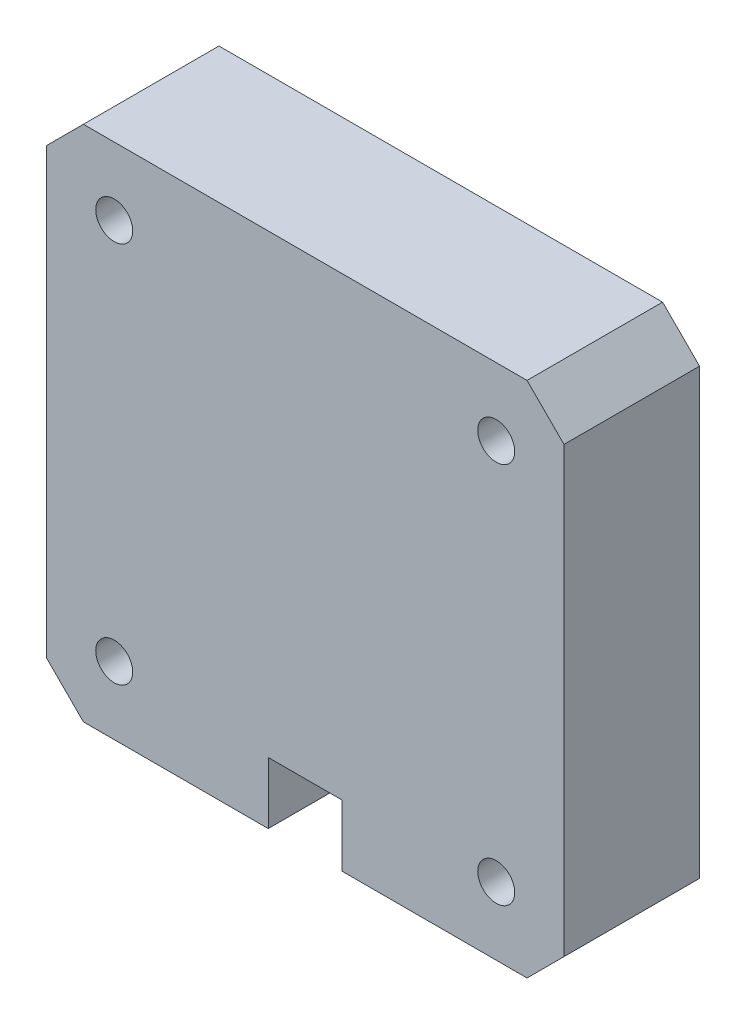
ISO-10303-21;
HEADER;
FILE_DESCRIPTION(('STEP AP214'),'2;1');
FILE_NAME('part.step','',(''),(''),'','','');
FILE_SCHEMA(('AUTOMOTIVE_DESIGN { 1 0 10303 214 1 1 1 1 }'));
ENDSEC;
DATA;
#1=APPLICATION_CONTEXT('core data for automotive mechanical design processes');
#2=APPLICATION_PROTOCOL_DEFINITION('international standard','automotive_design',2000,#1);
#3=PRODUCT_CONTEXT('',#1,'mechanical');
#4=PRODUCT('Part','Part','',(#3));
#5=PRODUCT_RELATED_PRODUCT_CATEGORY('part','',(#4));
#6=PRODUCT_DEFINITION_FORMATION('','',#4);
#7=PRODUCT_DEFINITION_CONTEXT('part definition',#1,'design');
#8=PRODUCT_DEFINITION('design','',#6,#7);
#9=PRODUCT_DEFINITION_SHAPE('','',#8);
#10=(LENGTH_UNIT() NAMED_UNIT(*) SI_UNIT(.MILLI.,.METRE.));
#11=(NAMED_UNIT(*) PLANE_ANGLE_UNIT() SI_UNIT($,.RADIAN.));
#12=(NAMED_UNIT(*) SI_UNIT($,.STERADIAN.) SOLID_ANGLE_UNIT());
#13=UNCERTAINTY_MEASURE_WITH_UNIT(LENGTH_MEASURE(1.E-05),#10,'distance_accuracy_value','');
#14=(GEOMETRIC_REPRESENTATION_CONTEXT(3) GLOBAL_UNCERTAINTY_ASSIGNED_CONTEXT((#13)) GLOBAL_UNIT_ASSIGNED_CONTEXT((#10,
#11,#12)) REPRESENTATION_CONTEXT('',''));
#15=CARTESIAN_POINT('',(0.,0.,0.));
#16=DIRECTION('',(0.,0.,1.));
#17=DIRECTION('',(1.,0.,0.));
#18=AXIS2_PLACEMENT_3D('',#15,#16,#17);
#19=CARTESIAN_POINT('',(15.5,-15.5,11.001));
#20=DIRECTION('',(0.,0.,-1.));
#21=DIRECTION('',(-1.,0.,0.));
#22=AXIS2_PLACEMENT_3D('',#19,#20,#21);
#23=CYLINDRICAL_SURFACE('',#22,1.5);
#24=CARTESIAN_POINT('',(15.5,-15.5,11.));
#25=DIRECTION('',(0.,0.,1.));
#26=DIRECTION('',(1.,0.,0.));
#27=AXIS2_PLACEMENT_3D('',#24,#25,#26);
#28=CIRCLE('',#27,1.5);
#29=CARTESIAN_POINT('',(17.,-15.5,11.));
#30=VERTEX_POINT('',#29);
#31=EDGE_CURVE('E180',#30,#30,#28,.F.);
#32=ORIENTED_EDGE('',*,*,#31,.F.);
#33=EDGE_LOOP('',(#32));
#34=FACE_BOUND('',#33,.T.);
#35=CARTESIAN_POINT('',(15.5,-15.5,3.));
#36=DIRECTION('',(0.,0.,-1.));
#37=DIRECTION('',(-1.,0.,0.));
#38=AXIS2_PLACEMENT_3D('',#35,#36,#37);
#39=CIRCLE('',#38,1.5);
#40=CARTESIAN_POINT('',(14.,-15.5,3.));
#41=VERTEX_POINT('',#40);
#42=EDGE_CURVE('E37',#41,#41,#39,.F.);
#43=ORIENTED_EDGE('',*,*,#42,.F.);
#44=EDGE_LOOP('',(#43));
#45=FACE_BOUND('',#44,.T.);
#46=ADVANCED_FACE('F33',(#34,#45),#23,.F.);
#47=CARTESIAN_POINT('',(-15.5,-15.5,11.001));
#48=DIRECTION('',(0.,0.,-1.));
#49=DIRECTION('',(-1.,0.,0.));
#50=AXIS2_PLACEMENT_3D('',#47,#48,#49);
#51=CYLINDRICAL_SURFACE('',#50,1.5);
#52=CARTESIAN_POINT('',(-15.5,-15.5,11.));
#53=DIRECTION('',(0.,0.,1.));
#54=DIRECTION('',(1.,0.,0.));
#55=AXIS2_PLACEMENT_3D('',#52,#53,#54);
#56=CIRCLE('',#55,1.5);
#57=CARTESIAN_POINT('',(-14.,-15.5,11.));
#58=VERTEX_POINT('',#57);
#59=EDGE_CURVE('E183',#58,#58,#56,.F.);
#60=ORIENTED_EDGE('',*,*,#59,.F.);
#61=EDGE_LOOP('',(#60));
#62=FACE_BOUND('',#61,.T.);
#63=CARTESIAN_POINT('',(-15.5,-15.5,3.));
#64=DIRECTION('',(0.,0.,-1.));
#65=DIRECTION('',(-1.,0.,0.));
#66=AXIS2_PLACEMENT_3D('',#63,#64,#65);
#67=CIRCLE('',#66,1.5);
#68=CARTESIAN_POINT('',(-17.,-15.5,3.));
#69=VERTEX_POINT('',#68);
#70=EDGE_CURVE('E162',#69,#69,#67,.F.);
#71=ORIENTED_EDGE('',*,*,#70,.F.);
#72=EDGE_LOOP('',(#71));
#73=FACE_BOUND('',#72,.T.);
#74=ADVANCED_FACE('F255',(#62,#73),#51,.F.);
#75=CARTESIAN_POINT('',(-15.5,15.5,11.001));
#76=DIRECTION('',(0.,0.,-1.));
#77=DIRECTION('',(-1.,0.,0.));
#78=AXIS2_PLACEMENT_3D('',#75,#76,#77);
#79=CYLINDRICAL_SURFACE('',#78,1.5);
#80=CARTESIAN_POINT('',(-15.5,15.5,11.));
#81=DIRECTION('',(0.,0.,1.));
#82=DIRECTION('',(1.,0.,0.));
#83=AXIS2_PLACEMENT_3D('',#80,#81,#82);
#84=CIRCLE('',#83,1.5);
#85=CARTESIAN_POINT('',(-14.,15.5,11.));
#86=VERTEX_POINT('',#85);
#87=EDGE_CURVE('E186',#86,#86,#84,.F.);
#88=ORIENTED_EDGE('',*,*,#87,.F.);
#89=EDGE_LOOP('',(#88));
#90=FACE_BOUND('',#89,.T.);
#91=CARTESIAN_POINT('',(-15.5,15.5,3.));
#92=DIRECTION('',(0.,0.,-1.));
#93=DIRECTION('',(-1.,0.,0.));
#94=AXIS2_PLACEMENT_3D('',#91,#92,#93);
#95=CIRCLE('',#94,1.5);
#96=CARTESIAN_POINT('',(-17.,15.5,3.));
#97=VERTEX_POINT('',#96);
#98=EDGE_CURVE('E169',#97,#97,#95,.F.);
#99=ORIENTED_EDGE('',*,*,#98,.F.);
#100=EDGE_LOOP('',(#99));
#101=FACE_BOUND('',#100,.T.);
#102=ADVANCED_FACE('F257',(#90,#101),#79,.F.);
#103=CARTESIAN_POINT('',(15.5,15.5,11.001));
#104=DIRECTION('',(0.,0.,-1.));
#105=DIRECTION('',(-1.,0.,0.));
#106=AXIS2_PLACEMENT_3D('',#103,#104,#105);
#107=CYLINDRICAL_SURFACE('',#106,1.5);
#108=CARTESIAN_POINT('',(15.5,15.5,11.));
#109=DIRECTION('',(0.,0.,1.));
#110=DIRECTION('',(1.,0.,0.));
#111=AXIS2_PLACEMENT_3D('',#108,#109,#110);
#112=CIRCLE('',#111,1.5);
#113=CARTESIAN_POINT('',(17.,15.5,11.));
#114=VERTEX_POINT('',#113);
#115=EDGE_CURVE('E189',#114,#114,#112,.F.);
#116=ORIENTED_EDGE('',*,*,#115,.F.);
#117=EDGE_LOOP('',(#116));
#118=FACE_BOUND('',#117,.T.);
#119=CARTESIAN_POINT('',(15.5,15.5,3.));
#120=DIRECTION('',(0.,0.,-1.));
#121=DIRECTION('',(-1.,0.,0.));
#122=AXIS2_PLACEMENT_3D('',#119,#120,#121);
#123=CIRCLE('',#122,1.5);
#124=CARTESIAN_POINT('',(14.,15.5,3.));
#125=VERTEX_POINT('',#124);
#126=EDGE_CURVE('E176',#125,#125,#123,.F.);
#127=ORIENTED_EDGE('',*,*,#126,.F.);
#128=EDGE_LOOP('',(#127));
#129=FACE_BOUND('',#128,.T.);
#130=ADVANCED_FACE('F264',(#118,#129),#107,.F.);
#131=CARTESIAN_POINT('',(-21.,21.,11.));
#132=DIRECTION('',(1.,0.,0.));
#133=DIRECTION('',(0.,0.,-1.));
#134=AXIS2_PLACEMENT_3D('',#131,#132,#133);
#135=PLANE('',#134);
#136=DIRECTION('',(0.,-1.,0.));
#137=VECTOR('',#136,1.);
#138=CARTESIAN_POINT('',(-21.,21.,0.));
#139=LINE('',#138,#137);
#140=CARTESIAN_POINT('',(-21.,18.,0.));
#141=VERTEX_POINT('',#140);
#142=CARTESIAN_POINT('',(-21.,-18.,0.));
#143=VERTEX_POINT('',#142);
#144=EDGE_CURVE('E192',#141,#143,#139,.T.);
#145=ORIENTED_EDGE('',*,*,#144,.T.);
#146=DIRECTION('',(0.,0.,1.));
#147=VECTOR('',#146,1.);
#148=CARTESIAN_POINT('',(-21.,-18.,11.));
#149=LINE('',#148,#147);
#150=CARTESIAN_POINT('',(-21.,-18.,11.));
#151=VERTEX_POINT('',#150);
#152=EDGE_CURVE('E243',#143,#151,#149,.T.);
#153=ORIENTED_EDGE('',*,*,#152,.T.);
#154=DIRECTION('',(0.,-1.,0.));
#155=VECTOR('',#154,1.);
#156=CARTESIAN_POINT('',(-21.,21.,11.));
#157=LINE('',#156,#155);
#158=CARTESIAN_POINT('',(-21.,18.,11.));
#159=VERTEX_POINT('',#158);
#160=EDGE_CURVE('E193',#159,#151,#157,.T.);
#161=ORIENTED_EDGE('',*,*,#160,.F.);
#162=DIRECTION('',(0.,0.,-1.));
#163=VECTOR('',#162,1.);
#164=CARTESIAN_POINT('',(-21.,18.,0.));
#165=LINE('',#164,#163);
#166=EDGE_CURVE('E240',#159,#141,#165,.T.);
#167=ORIENTED_EDGE('',*,*,#166,.T.);
#168=EDGE_LOOP('',(#145,#153,#161,#167));
#169=FACE_BOUND('',#168,.T.);
#170=ADVANCED_FACE('F274',(#169),#135,.F.);
#171=CARTESIAN_POINT('',(-21.,-21.,11.));
#172=DIRECTION('',(0.,1.,0.));
#173=DIRECTION('',(0.,0.,1.));
#174=AXIS2_PLACEMENT_3D('',#171,#172,#173);
#175=PLANE('',#174);
#176=DIRECTION('',(1.,0.,0.));
#177=VECTOR('',#176,1.);
#178=CARTESIAN_POINT('',(-21.,-21.,11.));
#179=LINE('',#178,#177);
#180=CARTESIAN_POINT('',(3.,-21.,11.));
#181=VERTEX_POINT('',#180);
#182=CARTESIAN_POINT('',(18.,-21.,11.));
#183=VERTEX_POINT('',#182);
#184=EDGE_CURVE('E196',#181,#183,#179,.T.);
#185=ORIENTED_EDGE('',*,*,#184,.F.);
#186=DIRECTION('',(0.,0.,1.));
#187=VECTOR('',#186,1.);
#188=CARTESIAN_POINT('',(3.,-21.,4.));
#189=LINE('',#188,#187);
#190=CARTESIAN_POINT('',(3.,-21.,4.));
#191=VERTEX_POINT('',#190);
#192=EDGE_CURVE('E327',#191,#181,#189,.T.);
#193=ORIENTED_EDGE('',*,*,#192,.F.);
#194=DIRECTION('',(1.,0.,0.));
#195=VECTOR('',#194,1.);
#196=CARTESIAN_POINT('',(3.,-21.,4.));
#197=LINE('',#196,#195);
#198=CARTESIAN_POINT('',(-3.,-21.,4.));
#199=VERTEX_POINT('',#198);
#200=EDGE_CURVE('E326',#199,#191,#197,.T.);
#201=ORIENTED_EDGE('',*,*,#200,.F.);
#202=DIRECTION('',(0.,0.,-1.));
#203=VECTOR('',#202,1.);
#204=CARTESIAN_POINT('',(-3.,-21.,4.));
#205=LINE('',#204,#203);
#206=CARTESIAN_POINT('',(-3.,-21.,11.));
#207=VERTEX_POINT('',#206);
#208=EDGE_CURVE('E323',#207,#199,#205,.T.);
#209=ORIENTED_EDGE('',*,*,#208,.F.);
#210=CARTESIAN_POINT('',(-18.,-21.,11.));
#211=VERTEX_POINT('',#210);
#212=EDGE_CURVE('E145',#211,#207,#179,.T.);
#213=ORIENTED_EDGE('',*,*,#212,.F.);
#214=DIRECTION('',(0.,0.,-1.));
#215=VECTOR('',#214,1.);
#216=CARTESIAN_POINT('',(-18.,-21.,11.));
#217=LINE('',#216,#215);
#218=CARTESIAN_POINT('',(-18.,-21.,0.));
#219=VERTEX_POINT('',#218);
#220=EDGE_CURVE('E227',#211,#219,#217,.T.);
#221=ORIENTED_EDGE('',*,*,#220,.T.);
#222=DIRECTION('',(1.,0.,0.));
#223=VECTOR('',#222,1.);
#224=CARTESIAN_POINT('',(-21.,-21.,0.));
#225=LINE('',#224,#223);
#226=CARTESIAN_POINT('',(18.,-21.,0.));
#227=VERTEX_POINT('',#226);
#228=EDGE_CURVE('E207',#219,#227,#225,.T.);
#229=ORIENTED_EDGE('',*,*,#228,.T.);
#230=DIRECTION('',(0.,0.,1.));
#231=VECTOR('',#230,1.);
#232=CARTESIAN_POINT('',(18.,-21.,11.));
#233=LINE('',#232,#231);
#234=EDGE_CURVE('E230',#227,#183,#233,.T.);
#235=ORIENTED_EDGE('',*,*,#234,.T.);
#236=EDGE_LOOP('',(#185,#193,#201,#209,#213,#221,#229,#235));
#237=FACE_BOUND('',#236,.T.);
#238=ADVANCED_FACE('F290',(#237),#175,.F.);
#239=CARTESIAN_POINT('',(21.,21.,11.));
#240=DIRECTION('',(1.,0.,0.));
#241=DIRECTION('',(0.,1.,0.));
#242=AXIS2_PLACEMENT_3D('',#239,#240,#241);
#243=PLANE('',#242);
#244=DIRECTION('',(0.,-1.,0.));
#245=VECTOR('',#244,1.);
#246=CARTESIAN_POINT('',(21.,21.,11.));
#247=LINE('',#246,#245);
#248=CARTESIAN_POINT('',(21.,18.,11.));
#249=VERTEX_POINT('',#248);
#250=CARTESIAN_POINT('',(21.,-18.,11.));
#251=VERTEX_POINT('',#250);
#252=EDGE_CURVE('E199',#249,#251,#247,.T.);
#253=ORIENTED_EDGE('',*,*,#252,.T.);
#254=DIRECTION('',(0.,0.,-1.));
#255=VECTOR('',#254,1.);
#256=CARTESIAN_POINT('',(21.,-18.,0.));
#257=LINE('',#256,#255);
#258=CARTESIAN_POINT('',(21.,-18.,0.));
#259=VERTEX_POINT('',#258);
#260=EDGE_CURVE('E216',#251,#259,#257,.T.);
#261=ORIENTED_EDGE('',*,*,#260,.T.);
#262=DIRECTION('',(0.,-1.,0.));
#263=VECTOR('',#262,1.);
#264=CARTESIAN_POINT('',(21.,21.,0.));
#265=LINE('',#264,#263);
#266=CARTESIAN_POINT('',(21.,18.,0.));
#267=VERTEX_POINT('',#266);
#268=EDGE_CURVE('E210',#267,#259,#265,.T.);
#269=ORIENTED_EDGE('',*,*,#268,.F.);
#270=DIRECTION('',(0.,0.,1.));
#271=VECTOR('',#270,1.);
#272=CARTESIAN_POINT('',(21.,18.,11.));
#273=LINE('',#272,#271);
#274=EDGE_CURVE('E204',#267,#249,#273,.T.);
#275=ORIENTED_EDGE('',*,*,#274,.T.);
#276=EDGE_LOOP('',(#253,#261,#269,#275));
#277=FACE_BOUND('',#276,.T.);
#278=ADVANCED_FACE('F286',(#277),#243,.T.);
#279=CARTESIAN_POINT('',(-21.,21.,11.));
#280=DIRECTION('',(0.,1.,0.));
#281=DIRECTION('',(0.,0.,1.));
#282=AXIS2_PLACEMENT_3D('',#279,#280,#281);
#283=PLANE('',#282);
#284=DIRECTION('',(1.,0.,0.));
#285=VECTOR('',#284,1.);
#286=CARTESIAN_POINT('',(-21.,21.,0.));
#287=LINE('',#286,#285);
#288=CARTESIAN_POINT('',(-18.,21.,0.));
#289=VERTEX_POINT('',#288);
#290=CARTESIAN_POINT('',(18.,21.,0.));
#291=VERTEX_POINT('',#290);
#292=EDGE_CURVE('E197',#289,#291,#287,.T.);
#293=ORIENTED_EDGE('',*,*,#292,.F.);
#294=DIRECTION('',(0.,0.,1.));
#295=VECTOR('',#294,1.);
#296=CARTESIAN_POINT('',(-18.,21.,11.));
#297=LINE('',#296,#295);
#298=CARTESIAN_POINT('',(-18.,21.,11.));
#299=VERTEX_POINT('',#298);
#300=EDGE_CURVE('E11',#289,#299,#297,.T.);
#301=ORIENTED_EDGE('',*,*,#300,.T.);
#302=DIRECTION('',(1.,0.,0.));
#303=VECTOR('',#302,1.);
#304=CARTESIAN_POINT('',(-21.,21.,11.));
#305=LINE('',#304,#303);
#306=CARTESIAN_POINT('',(18.,21.,11.));
#307=VERTEX_POINT('',#306);
#308=EDGE_CURVE('E202',#299,#307,#305,.T.);
#309=ORIENTED_EDGE('',*,*,#308,.T.);
#310=DIRECTION('',(0.,0.,-1.));
#311=VECTOR('',#310,1.);
#312=CARTESIAN_POINT('',(18.,21.,11.));
#313=LINE('',#312,#311);
#314=EDGE_CURVE('E42',#307,#291,#313,.T.);
#315=ORIENTED_EDGE('',*,*,#314,.T.);
#316=EDGE_LOOP('',(#293,#301,#309,#315));
#317=FACE_BOUND('',#316,.T.);
#318=ADVANCED_FACE('F279',(#317),#283,.T.);
#319=CARTESIAN_POINT('',(0.,0.,11.));
#320=DIRECTION('',(0.,0.,1.));
#321=DIRECTION('',(1.,0.,0.));
#322=AXIS2_PLACEMENT_3D('',#319,#320,#321);
#323=PLANE('',#322);
#324=DIRECTION('',(0.,-1.,0.));
#325=VECTOR('',#324,1.);
#326=CARTESIAN_POINT('',(3.,-16.,11.));
#327=LINE('',#326,#325);
#328=CARTESIAN_POINT('',(3.,-16.,11.));
#329=VERTEX_POINT('',#328);
#330=EDGE_CURVE('E146',#329,#181,#327,.T.);
#331=ORIENTED_EDGE('',*,*,#330,.T.);
#332=ORIENTED_EDGE('',*,*,#184,.T.);
#333=DIRECTION('',(0.707106781186549,0.707106781186546,0.));
#334=VECTOR('',#333,1.);
#335=CARTESIAN_POINT('',(19.5,-19.5,11.));
#336=LINE('',#335,#334);
#337=EDGE_CURVE('E238',#183,#251,#336,.T.);
#338=ORIENTED_EDGE('',*,*,#337,.T.);
#339=ORIENTED_EDGE('',*,*,#252,.F.);
#340=DIRECTION('',(0.707106781186546,-0.707106781186549,0.));
#341=VECTOR('',#340,1.);
#342=CARTESIAN_POINT('',(19.5,19.5,11.));
#343=LINE('',#342,#341);
#344=EDGE_CURVE('E58',#249,#307,#343,.F.);
#345=ORIENTED_EDGE('',*,*,#344,.T.);
#346=ORIENTED_EDGE('',*,*,#308,.F.);
#347=DIRECTION('',(-0.707106781186549,-0.707106781186546,0.));
#348=VECTOR('',#347,1.);
#349=CARTESIAN_POINT('',(-19.5,19.5,11.));
#350=LINE('',#349,#348);
#351=EDGE_CURVE('E234',#299,#159,#350,.T.);
#352=ORIENTED_EDGE('',*,*,#351,.T.);
#353=ORIENTED_EDGE('',*,*,#160,.T.);
#354=DIRECTION('',(-0.707106781186546,0.707106781186549,0.));
#355=VECTOR('',#354,1.);
#356=CARTESIAN_POINT('',(-19.5,-19.5,11.));
#357=LINE('',#356,#355);
#358=EDGE_CURVE('E236',#151,#211,#357,.F.);
#359=ORIENTED_EDGE('',*,*,#358,.T.);
#360=ORIENTED_EDGE('',*,*,#212,.T.);
#361=DIRECTION('',(0.,-1.,0.));
#362=VECTOR('',#361,1.);
#363=CARTESIAN_POINT('',(-3.,-16.,11.));
#364=LINE('',#363,#362);
#365=CARTESIAN_POINT('',(-3.,-16.,11.));
#366=VERTEX_POINT('',#365);
#367=EDGE_CURVE('E130',#366,#207,#364,.T.);
#368=ORIENTED_EDGE('',*,*,#367,.F.);
#369=DIRECTION('',(-1.,0.,0.));
#370=VECTOR('',#369,1.);
#371=CARTESIAN_POINT('',(3.,-16.,11.));
#372=LINE('',#371,#370);
#373=EDGE_CURVE('E135',#329,#366,#372,.T.);
#374=ORIENTED_EDGE('',*,*,#373,.F.);
#375=EDGE_LOOP('',(#331,#332,#338,#339,#345,#346,#352,#353,#359,#360,#368,#374));
#376=FACE_BOUND('',#375,.T.);
#377=ORIENTED_EDGE('',*,*,#31,.T.);
#378=EDGE_LOOP('',(#377));
#379=FACE_BOUND('',#378,.T.);
#380=ORIENTED_EDGE('',*,*,#59,.T.);
#381=EDGE_LOOP('',(#380));
#382=FACE_BOUND('',#381,.T.);
#383=ORIENTED_EDGE('',*,*,#87,.T.);
#384=EDGE_LOOP('',(#383));
#385=FACE_BOUND('',#384,.T.);
#386=ORIENTED_EDGE('',*,*,#115,.T.);
#387=EDGE_LOOP('',(#386));
#388=FACE_BOUND('',#387,.T.);
#389=ADVANCED_FACE('F142',(#376,#379,#382,#385,#388),#323,.T.);
#390=CARTESIAN_POINT('',(0.,0.,0.));
#391=DIRECTION('',(0.,0.,1.));
#392=DIRECTION('',(1.,0.,0.));
#393=AXIS2_PLACEMENT_3D('',#390,#391,#392);
#394=PLANE('',#393);
#395=CARTESIAN_POINT('',(15.5,-15.5,0.));
#396=DIRECTION('',(0.,0.,-1.));
#397=DIRECTION('',(-1.,0.,0.));
#398=AXIS2_PLACEMENT_3D('',#395,#396,#397);
#399=CIRCLE('',#398,2.85);
#400=CARTESIAN_POINT('',(12.65,-15.5,0.));
#401=VERTEX_POINT('',#400);
#402=EDGE_CURVE('E156',#401,#401,#399,.T.);
#403=ORIENTED_EDGE('',*,*,#402,.F.);
#404=EDGE_LOOP('',(#403));
#405=FACE_BOUND('',#404,.T.);
#406=CARTESIAN_POINT('',(-15.5,-15.5,0.));
#407=DIRECTION('',(0.,0.,-1.));
#408=DIRECTION('',(-1.,0.,0.));
#409=AXIS2_PLACEMENT_3D('',#406,#407,#408);
#410=CIRCLE('',#409,2.85);
#411=CARTESIAN_POINT('',(-18.35,-15.5,0.));
#412=VERTEX_POINT('',#411);
#413=EDGE_CURVE('E163',#412,#412,#410,.T.);
#414=ORIENTED_EDGE('',*,*,#413,.F.);
#415=EDGE_LOOP('',(#414));
#416=FACE_BOUND('',#415,.T.);
#417=CARTESIAN_POINT('',(-15.5,15.5,0.));
#418=DIRECTION('',(0.,0.,-1.));
#419=DIRECTION('',(-1.,0.,0.));
#420=AXIS2_PLACEMENT_3D('',#417,#418,#419);
#421=CIRCLE('',#420,2.85);
#422=CARTESIAN_POINT('',(-18.35,15.5,0.));
#423=VERTEX_POINT('',#422);
#424=EDGE_CURVE('E170',#423,#423,#421,.T.);
#425=ORIENTED_EDGE('',*,*,#424,.F.);
#426=EDGE_LOOP('',(#425));
#427=FACE_BOUND('',#426,.T.);
#428=CARTESIAN_POINT('',(15.5,15.5,0.));
#429=DIRECTION('',(0.,0.,-1.));
#430=DIRECTION('',(-1.,0.,0.));
#431=AXIS2_PLACEMENT_3D('',#428,#429,#430);
#432=CIRCLE('',#431,2.85);
#433=CARTESIAN_POINT('',(12.65,15.5,0.));
#434=VERTEX_POINT('',#433);
#435=EDGE_CURVE('E177',#434,#434,#432,.T.);
#436=ORIENTED_EDGE('',*,*,#435,.F.);
#437=EDGE_LOOP('',(#436));
#438=FACE_BOUND('',#437,.T.);
#439=ORIENTED_EDGE('',*,*,#268,.T.);
#440=DIRECTION('',(-0.707106781186549,-0.707106781186546,0.));
#441=VECTOR('',#440,1.);
#442=CARTESIAN_POINT('',(21.,-18.,0.));
#443=LINE('',#442,#441);
#444=EDGE_CURVE('E225',#259,#227,#443,.T.);
#445=ORIENTED_EDGE('',*,*,#444,.T.);
#446=ORIENTED_EDGE('',*,*,#228,.F.);
#447=DIRECTION('',(0.707106781186546,-0.707106781186549,0.));
#448=VECTOR('',#447,1.);
#449=CARTESIAN_POINT('',(-18.,-21.,0.));
#450=LINE('',#449,#448);
#451=EDGE_CURVE('E223',#219,#143,#450,.F.);
#452=ORIENTED_EDGE('',*,*,#451,.T.);
#453=ORIENTED_EDGE('',*,*,#144,.F.);
#454=DIRECTION('',(0.707106781186549,0.707106781186546,0.));
#455=VECTOR('',#454,1.);
#456=CARTESIAN_POINT('',(-21.,18.,0.));
#457=LINE('',#456,#455);
#458=EDGE_CURVE('E221',#141,#289,#457,.T.);
#459=ORIENTED_EDGE('',*,*,#458,.T.);
#460=ORIENTED_EDGE('',*,*,#292,.T.);
#461=DIRECTION('',(-0.707106781186546,0.707106781186549,0.));
#462=VECTOR('',#461,1.);
#463=CARTESIAN_POINT('',(18.,21.,0.));
#464=LINE('',#463,#462);
#465=EDGE_CURVE('E219',#291,#267,#464,.F.);
#466=ORIENTED_EDGE('',*,*,#465,.T.);
#467=EDGE_LOOP('',(#439,#445,#446,#452,#453,#459,#460,#466));
#468=FACE_BOUND('',#467,.T.);
#469=ADVANCED_FACE('F278',(#405,#416,#427,#438,#468),#394,.F.);
#470=CARTESIAN_POINT('',(21.,-18.,11.));
#471=DIRECTION('',(0.707106781186546,-0.707106781186549,0.));
#472=DIRECTION('',(0.,0.,1.));
#473=AXIS2_PLACEMENT_3D('',#470,#471,#472);
#474=PLANE('',#473);
#475=ORIENTED_EDGE('',*,*,#337,.F.);
#476=ORIENTED_EDGE('',*,*,#234,.F.);
#477=ORIENTED_EDGE('',*,*,#444,.F.);
#478=ORIENTED_EDGE('',*,*,#260,.F.);
#479=EDGE_LOOP('',(#475,#476,#477,#478));
#480=FACE_BOUND('',#479,.T.);
#481=ADVANCED_FACE('F282',(#480),#474,.T.);
#482=CARTESIAN_POINT('',(-18.,-21.,11.));
#483=DIRECTION('',(0.707106781186549,0.707106781186546,0.));
#484=DIRECTION('',(0.,0.,-1.));
#485=AXIS2_PLACEMENT_3D('',#482,#483,#484);
#486=PLANE('',#485);
#487=ORIENTED_EDGE('',*,*,#358,.F.);
#488=ORIENTED_EDGE('',*,*,#152,.F.);
#489=ORIENTED_EDGE('',*,*,#451,.F.);
#490=ORIENTED_EDGE('',*,*,#220,.F.);
#491=EDGE_LOOP('',(#487,#488,#489,#490));
#492=FACE_BOUND('',#491,.T.);
#493=ADVANCED_FACE('F300',(#492),#486,.F.);
#494=CARTESIAN_POINT('',(-21.,18.,11.));
#495=DIRECTION('',(-0.707106781186546,0.707106781186549,0.));
#496=DIRECTION('',(0.,0.,1.));
#497=AXIS2_PLACEMENT_3D('',#494,#495,#496);
#498=PLANE('',#497);
#499=ORIENTED_EDGE('',*,*,#351,.F.);
#500=ORIENTED_EDGE('',*,*,#300,.F.);
#501=ORIENTED_EDGE('',*,*,#458,.F.);
#502=ORIENTED_EDGE('',*,*,#166,.F.);
#503=EDGE_LOOP('',(#499,#500,#501,#502));
#504=FACE_BOUND('',#503,.T.);
#505=ADVANCED_FACE('F303',(#504),#498,.T.);
#506=CARTESIAN_POINT('',(18.,21.,11.));
#507=DIRECTION('',(-0.707106781186549,-0.707106781186546,0.));
#508=DIRECTION('',(0.,0.,-1.));
#509=AXIS2_PLACEMENT_3D('',#506,#507,#508);
#510=PLANE('',#509);
#511=ORIENTED_EDGE('',*,*,#344,.F.);
#512=ORIENTED_EDGE('',*,*,#274,.F.);
#513=ORIENTED_EDGE('',*,*,#465,.F.);
#514=ORIENTED_EDGE('',*,*,#314,.F.);
#515=EDGE_LOOP('',(#511,#512,#513,#514));
#516=FACE_BOUND('',#515,.T.);
#517=ADVANCED_FACE('F35',(#516),#510,.F.);
#518=CARTESIAN_POINT('',(15.5,15.5,3.));
#519=DIRECTION('',(0.,0.,-1.));
#520=DIRECTION('',(-1.,0.,0.));
#521=AXIS2_PLACEMENT_3D('',#518,#519,#520);
#522=PLANE('',#521);
#523=CARTESIAN_POINT('',(15.5,15.5,3.));
#524=DIRECTION('',(0.,0.,-1.));
#525=DIRECTION('',(-1.,0.,0.));
#526=AXIS2_PLACEMENT_3D('',#523,#524,#525);
#527=CIRCLE('',#526,2.85);
#528=CARTESIAN_POINT('',(12.65,15.5,3.));
#529=VERTEX_POINT('',#528);
#530=EDGE_CURVE('E173',#529,#529,#527,.T.);
#531=ORIENTED_EDGE('',*,*,#530,.T.);
#532=EDGE_LOOP('',(#531));
#533=FACE_BOUND('',#532,.T.);
#534=ORIENTED_EDGE('',*,*,#126,.T.);
#535=EDGE_LOOP('',(#534));
#536=FACE_BOUND('',#535,.T.);
#537=ADVANCED_FACE('F310',(#533,#536),#522,.T.);
#538=CARTESIAN_POINT('',(15.5,15.5,3.));
#539=DIRECTION('',(0.,0.,-1.));
#540=DIRECTION('',(-1.,0.,0.));
#541=AXIS2_PLACEMENT_3D('',#538,#539,#540);
#542=CYLINDRICAL_SURFACE('',#541,2.85);
#543=ORIENTED_EDGE('',*,*,#530,.F.);
#544=EDGE_LOOP('',(#543));
#545=FACE_BOUND('',#544,.T.);
#546=ORIENTED_EDGE('',*,*,#435,.T.);
#547=EDGE_LOOP('',(#546));
#548=FACE_BOUND('',#547,.T.);
#549=ADVANCED_FACE('F374',(#545,#548),#542,.F.);
#550=CARTESIAN_POINT('',(-15.5,15.5,3.));
#551=DIRECTION('',(0.,0.,-1.));
#552=DIRECTION('',(-1.,0.,0.));
#553=AXIS2_PLACEMENT_3D('',#550,#551,#552);
#554=PLANE('',#553);
#555=CARTESIAN_POINT('',(-15.5,15.5,3.));
#556=DIRECTION('',(0.,0.,-1.));
#557=DIRECTION('',(-1.,0.,0.));
#558=AXIS2_PLACEMENT_3D('',#555,#556,#557);
#559=CIRCLE('',#558,2.85);
#560=CARTESIAN_POINT('',(-18.35,15.5,3.));
#561=VERTEX_POINT('',#560);
#562=EDGE_CURVE('E166',#561,#561,#559,.T.);
#563=ORIENTED_EDGE('',*,*,#562,.T.);
#564=EDGE_LOOP('',(#563));
#565=FACE_BOUND('',#564,.T.);
#566=ORIENTED_EDGE('',*,*,#98,.T.);
#567=EDGE_LOOP('',(#566));
#568=FACE_BOUND('',#567,.T.);
#569=ADVANCED_FACE('F371',(#565,#568),#554,.T.);
#570=CARTESIAN_POINT('',(-15.5,15.5,3.));
#571=DIRECTION('',(0.,0.,-1.));
#572=DIRECTION('',(-1.,0.,0.));
#573=AXIS2_PLACEMENT_3D('',#570,#571,#572);
#574=CYLINDRICAL_SURFACE('',#573,2.85);
#575=ORIENTED_EDGE('',*,*,#562,.F.);
#576=EDGE_LOOP('',(#575));
#577=FACE_BOUND('',#576,.T.);
#578=ORIENTED_EDGE('',*,*,#424,.T.);
#579=EDGE_LOOP('',(#578));
#580=FACE_BOUND('',#579,.T.);
#581=ADVANCED_FACE('F366',(#577,#580),#574,.F.);
#582=CARTESIAN_POINT('',(-15.5,-15.5,3.));
#583=DIRECTION('',(0.,0.,-1.));
#584=DIRECTION('',(-1.,0.,0.));
#585=AXIS2_PLACEMENT_3D('',#582,#583,#584);
#586=PLANE('',#585);
#587=CARTESIAN_POINT('',(-15.5,-15.5,3.));
#588=DIRECTION('',(0.,0.,-1.));
#589=DIRECTION('',(-1.,0.,0.));
#590=AXIS2_PLACEMENT_3D('',#587,#588,#589);
#591=CIRCLE('',#590,2.85);
#592=CARTESIAN_POINT('',(-18.35,-15.5,3.));
#593=VERTEX_POINT('',#592);
#594=EDGE_CURVE('E159',#593,#593,#591,.T.);
#595=ORIENTED_EDGE('',*,*,#594,.T.);
#596=EDGE_LOOP('',(#595));
#597=FACE_BOUND('',#596,.T.);
#598=ORIENTED_EDGE('',*,*,#70,.T.);
#599=EDGE_LOOP('',(#598));
#600=FACE_BOUND('',#599,.T.);
#601=ADVANCED_FACE('F253',(#597,#600),#586,.T.);
#602=CARTESIAN_POINT('',(-15.5,-15.5,3.));
#603=DIRECTION('',(0.,0.,-1.));
#604=DIRECTION('',(-1.,0.,0.));
#605=AXIS2_PLACEMENT_3D('',#602,#603,#604);
#606=CYLINDRICAL_SURFACE('',#605,2.85);
#607=ORIENTED_EDGE('',*,*,#594,.F.);
#608=EDGE_LOOP('',(#607));
#609=FACE_BOUND('',#608,.T.);
#610=ORIENTED_EDGE('',*,*,#413,.T.);
#611=EDGE_LOOP('',(#610));
#612=FACE_BOUND('',#611,.T.);
#613=ADVANCED_FACE('F359',(#609,#612),#606,.F.);
#614=CARTESIAN_POINT('',(15.5,-15.5,3.));
#615=DIRECTION('',(0.,0.,-1.));
#616=DIRECTION('',(-1.,0.,0.));
#617=AXIS2_PLACEMENT_3D('',#614,#615,#616);
#618=PLANE('',#617);
#619=CARTESIAN_POINT('',(15.5,-15.5,3.));
#620=DIRECTION('',(0.,0.,-1.));
#621=DIRECTION('',(-1.,0.,0.));
#622=AXIS2_PLACEMENT_3D('',#619,#620,#621);
#623=CIRCLE('',#622,2.85);
#624=CARTESIAN_POINT('',(12.65,-15.5,3.));
#625=VERTEX_POINT('',#624);
#626=EDGE_CURVE('E153',#625,#625,#623,.T.);
#627=ORIENTED_EDGE('',*,*,#626,.T.);
#628=EDGE_LOOP('',(#627));
#629=FACE_BOUND('',#628,.T.);
#630=ORIENTED_EDGE('',*,*,#42,.T.);
#631=EDGE_LOOP('',(#630));
#632=FACE_BOUND('',#631,.T.);
#633=ADVANCED_FACE('F356',(#629,#632),#618,.T.);
#634=CARTESIAN_POINT('',(15.5,-15.5,3.));
#635=DIRECTION('',(0.,0.,-1.));
#636=DIRECTION('',(-1.,0.,0.));
#637=AXIS2_PLACEMENT_3D('',#634,#635,#636);
#638=CYLINDRICAL_SURFACE('',#637,2.85);
#639=ORIENTED_EDGE('',*,*,#626,.F.);
#640=EDGE_LOOP('',(#639));
#641=FACE_BOUND('',#640,.T.);
#642=ORIENTED_EDGE('',*,*,#402,.T.);
#643=EDGE_LOOP('',(#642));
#644=FACE_BOUND('',#643,.T.);
#645=ADVANCED_FACE('F352',(#641,#644),#638,.F.);
#646=CARTESIAN_POINT('',(3.,-16.,4.));
#647=DIRECTION('',(1.,0.,0.));
#648=DIRECTION('',(0.,0.,-1.));
#649=AXIS2_PLACEMENT_3D('',#646,#647,#648);
#650=PLANE('',#649);
#651=ORIENTED_EDGE('',*,*,#192,.T.);
#652=ORIENTED_EDGE('',*,*,#330,.F.);
#653=DIRECTION('',(0.,0.,1.));
#654=VECTOR('',#653,1.);
#655=CARTESIAN_POINT('',(3.,-16.,4.));
#656=LINE('',#655,#654);
#657=CARTESIAN_POINT('',(3.,-16.,4.));
#658=VERTEX_POINT('',#657);
#659=EDGE_CURVE('E50',#658,#329,#656,.T.);
#660=ORIENTED_EDGE('',*,*,#659,.F.);
#661=DIRECTION('',(0.,-1.,0.));
#662=VECTOR('',#661,1.);
#663=CARTESIAN_POINT('',(3.,-16.,4.));
#664=LINE('',#663,#662);
#665=EDGE_CURVE('E148',#658,#191,#664,.T.);
#666=ORIENTED_EDGE('',*,*,#665,.T.);
#667=EDGE_LOOP('',(#651,#652,#660,#666));
#668=FACE_BOUND('',#667,.T.);
#669=ADVANCED_FACE('F333',(#668),#650,.F.);
#670=CARTESIAN_POINT('',(3.,-16.,4.));
#671=DIRECTION('',(0.,0.,-1.));
#672=DIRECTION('',(-1.,0.,0.));
#673=AXIS2_PLACEMENT_3D('',#670,#671,#672);
#674=PLANE('',#673);
#675=ORIENTED_EDGE('',*,*,#200,.T.);
#676=ORIENTED_EDGE('',*,*,#665,.F.);
#677=DIRECTION('',(1.,0.,0.));
#678=VECTOR('',#677,1.);
#679=CARTESIAN_POINT('',(3.,-16.,4.));
#680=LINE('',#679,#678);
#681=CARTESIAN_POINT('',(-3.,-16.,4.));
#682=VERTEX_POINT('',#681);
#683=EDGE_CURVE('E134',#682,#658,#680,.T.);
#684=ORIENTED_EDGE('',*,*,#683,.F.);
#685=DIRECTION('',(0.,-1.,0.));
#686=VECTOR('',#685,1.);
#687=CARTESIAN_POINT('',(-3.,-16.,4.));
#688=LINE('',#687,#686);
#689=EDGE_CURVE('E132',#682,#199,#688,.T.);
#690=ORIENTED_EDGE('',*,*,#689,.T.);
#691=EDGE_LOOP('',(#675,#676,#684,#690));
#692=FACE_BOUND('',#691,.T.);
#693=ADVANCED_FACE('F335',(#692),#674,.F.);
#694=CARTESIAN_POINT('',(-3.,-16.,4.));
#695=DIRECTION('',(-1.,0.,0.));
#696=DIRECTION('',(0.,0.,1.));
#697=AXIS2_PLACEMENT_3D('',#694,#695,#696);
#698=PLANE('',#697);
#699=ORIENTED_EDGE('',*,*,#208,.T.);
#700=ORIENTED_EDGE('',*,*,#689,.F.);
#701=DIRECTION('',(0.,0.,-1.));
#702=VECTOR('',#701,1.);
#703=CARTESIAN_POINT('',(-3.,-16.,4.));
#704=LINE('',#703,#702);
#705=EDGE_CURVE('E126',#366,#682,#704,.T.);
#706=ORIENTED_EDGE('',*,*,#705,.F.);
#707=ORIENTED_EDGE('',*,*,#367,.T.);
#708=EDGE_LOOP('',(#699,#700,#706,#707));
#709=FACE_BOUND('',#708,.T.);
#710=ADVANCED_FACE('F128',(#709),#698,.F.);
#711=CARTESIAN_POINT('',(0.,-16.,0.));
#712=DIRECTION('',(0.,-1.,0.));
#713=DIRECTION('',(0.,0.,-1.));
#714=AXIS2_PLACEMENT_3D('',#711,#712,#713);
#715=PLANE('',#714);
#716=ORIENTED_EDGE('',*,*,#659,.T.);
#717=ORIENTED_EDGE('',*,*,#373,.T.);
#718=ORIENTED_EDGE('',*,*,#705,.T.);
#719=ORIENTED_EDGE('',*,*,#683,.T.);
#720=EDGE_LOOP('',(#716,#717,#718,#719));
#721=FACE_BOUND('',#720,.T.);
#722=ADVANCED_FACE('F138',(#721),#715,.T.);
#723=CLOSED_SHELL('',(#46,#74,#102,#130,#170,#238,#278,#318,#389,#469,#481,#493,#505,#517,#537,
#549,#569,#581,#601,#613,#633,#645,#669,#693,#710,#722));
#724=MANIFOLD_SOLID_BREP('B2',#723);
#725=ADVANCED_BREP_SHAPE_REPRESENTATION('',(#18,#724),#14);
#726=SHAPE_DEFINITION_REPRESENTATION(#9,#725);
ENDSEC;
END-ISO-10303-21;
